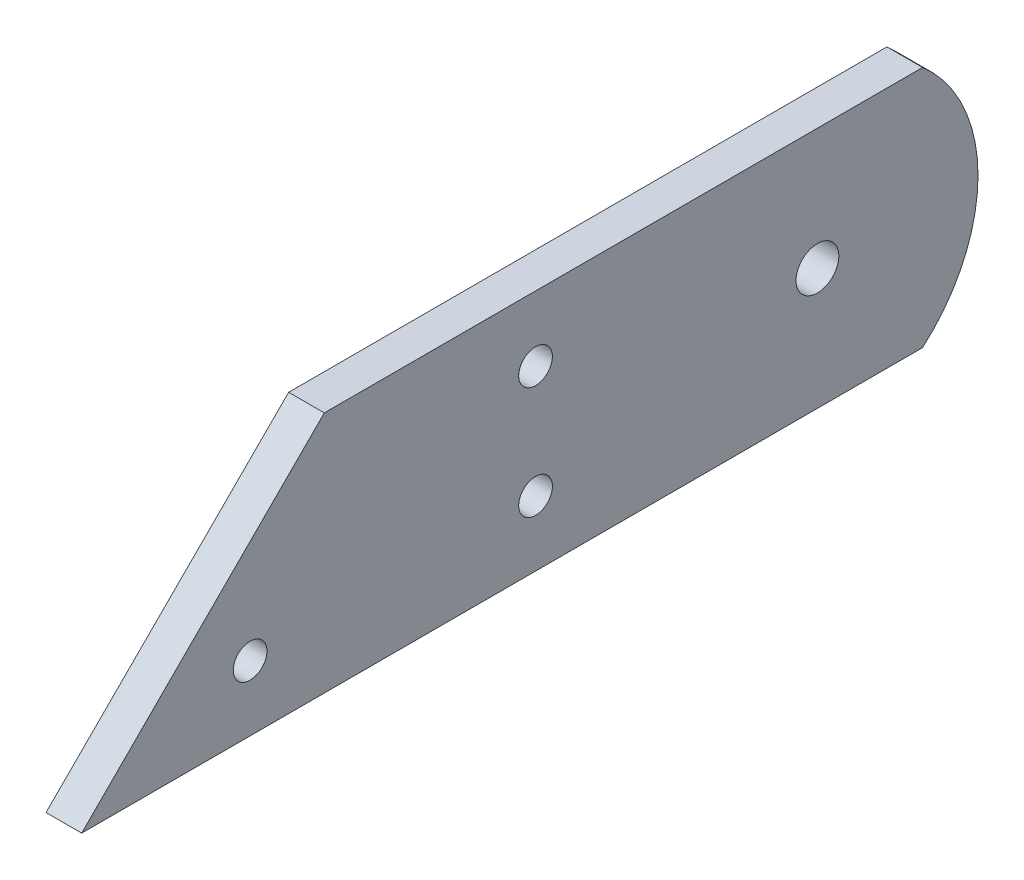
ISO-10303-21;
HEADER;
FILE_DESCRIPTION(('STEP AP214'),'2;1');
FILE_NAME('part.step','',(''),(''),'','','');
FILE_SCHEMA(('AUTOMOTIVE_DESIGN { 1 0 10303 214 1 1 1 1 }'));
ENDSEC;
DATA;
#1=APPLICATION_CONTEXT('core data for automotive mechanical design processes');
#2=APPLICATION_PROTOCOL_DEFINITION('international standard','automotive_design',2000,#1);
#3=PRODUCT_CONTEXT('',#1,'mechanical');
#4=PRODUCT('Part','Part','',(#3));
#5=PRODUCT_RELATED_PRODUCT_CATEGORY('part','',(#4));
#6=PRODUCT_DEFINITION_FORMATION('','',#4);
#7=PRODUCT_DEFINITION_CONTEXT('part definition',#1,'design');
#8=PRODUCT_DEFINITION('design','',#6,#7);
#9=PRODUCT_DEFINITION_SHAPE('','',#8);
#10=(LENGTH_UNIT() NAMED_UNIT(*) SI_UNIT(.MILLI.,.METRE.));
#11=(NAMED_UNIT(*) PLANE_ANGLE_UNIT() SI_UNIT($,.RADIAN.));
#12=(NAMED_UNIT(*) SI_UNIT($,.STERADIAN.) SOLID_ANGLE_UNIT());
#13=UNCERTAINTY_MEASURE_WITH_UNIT(LENGTH_MEASURE(1.E-05),#10,'distance_accuracy_value','');
#14=(GEOMETRIC_REPRESENTATION_CONTEXT(3) GLOBAL_UNCERTAINTY_ASSIGNED_CONTEXT((#13)) GLOBAL_UNIT_ASSIGNED_CONTEXT((#10,
#11,#12)) REPRESENTATION_CONTEXT('',''));
#15=CARTESIAN_POINT('',(0.,0.,0.));
#16=DIRECTION('',(0.,0.,1.));
#17=DIRECTION('',(1.,0.,0.));
#18=AXIS2_PLACEMENT_3D('',#15,#16,#17);
#19=CARTESIAN_POINT('',(6.35,43.18,0.));
#20=DIRECTION('',(0.,-1.,0.));
#21=DIRECTION('',(0.,0.,-1.));
#22=AXIS2_PLACEMENT_3D('',#19,#20,#21);
#23=PLANE('',#22);
#24=DIRECTION('',(0.,0.,1.));
#25=VECTOR('',#24,1.);
#26=CARTESIAN_POINT('',(0.,43.18,0.));
#27=LINE('',#26,#25);
#28=CARTESIAN_POINT('',(0.,43.18,-43.4811108330197));
#29=VERTEX_POINT('',#28);
#30=CARTESIAN_POINT('',(0.,43.18,62.9919999999995));
#31=VERTEX_POINT('',#30);
#32=EDGE_CURVE('E94',#29,#31,#27,.T.);
#33=ORIENTED_EDGE('',*,*,#32,.T.);
#34=DIRECTION('',(-1.,0.,0.));
#35=VECTOR('',#34,1.);
#36=CARTESIAN_POINT('',(6.35,43.18,62.9919999999995));
#37=LINE('',#36,#35);
#38=CARTESIAN_POINT('',(6.35,43.18,62.9919999999995));
#39=VERTEX_POINT('',#38);
#40=EDGE_CURVE('E11',#39,#31,#37,.T.);
#41=ORIENTED_EDGE('',*,*,#40,.F.);
#42=DIRECTION('',(0.,0.,1.));
#43=VECTOR('',#42,1.);
#44=CARTESIAN_POINT('',(6.35,43.18,0.));
#45=LINE('',#44,#43);
#46=CARTESIAN_POINT('',(6.34999999999999,43.18,-43.4811108330197));
#47=VERTEX_POINT('',#46);
#48=EDGE_CURVE('E49',#47,#39,#45,.T.);
#49=ORIENTED_EDGE('',*,*,#48,.F.);
#50=DIRECTION('',(-1.,0.,0.));
#51=VECTOR('',#50,1.);
#52=CARTESIAN_POINT('',(80.1238835157808,43.18,-43.4811108330197));
#53=LINE('',#52,#51);
#54=EDGE_CURVE('E90',#47,#29,#53,.T.);
#55=ORIENTED_EDGE('',*,*,#54,.T.);
#56=EDGE_LOOP('',(#33,#41,#49,#55));
#57=FACE_BOUND('',#56,.T.);
#58=ADVANCED_FACE('F35',(#57),#23,.F.);
#59=CARTESIAN_POINT('',(6.35,0.,106.172));
#60=DIRECTION('',(0.,-0.707106781186551,-0.707106781186544));
#61=DIRECTION('',(0.,0.707106781186544,-0.707106781186551));
#62=AXIS2_PLACEMENT_3D('',#59,#60,#61);
#63=PLANE('',#62);
#64=DIRECTION('',(0.,-0.707106781186544,0.707106781186551));
#65=VECTOR('',#64,1.);
#66=CARTESIAN_POINT('',(0.,0.,106.172));
#67=LINE('',#66,#65);
#68=CARTESIAN_POINT('',(0.,0.,106.172));
#69=VERTEX_POINT('',#68);
#70=EDGE_CURVE('E83',#31,#69,#67,.T.);
#71=ORIENTED_EDGE('',*,*,#70,.T.);
#72=DIRECTION('',(1.,0.,0.));
#73=VECTOR('',#72,1.);
#74=CARTESIAN_POINT('',(0.,0.,106.172));
#75=LINE('',#74,#73);
#76=CARTESIAN_POINT('',(6.34999999999999,2.48065457064683E-13,106.172));
#77=VERTEX_POINT('',#76);
#78=EDGE_CURVE('E79',#69,#77,#75,.T.);
#79=ORIENTED_EDGE('',*,*,#78,.T.);
#80=DIRECTION('',(0.,-0.707106781186544,0.707106781186551));
#81=VECTOR('',#80,1.);
#82=CARTESIAN_POINT('',(6.35,0.,106.172));
#83=LINE('',#82,#81);
#84=EDGE_CURVE('E126',#39,#77,#83,.T.);
#85=ORIENTED_EDGE('',*,*,#84,.F.);
#86=ORIENTED_EDGE('',*,*,#40,.T.);
#87=EDGE_LOOP('',(#71,#79,#85,#86));
#88=FACE_BOUND('',#87,.T.);
#89=ADVANCED_FACE('F131',(#88),#63,.F.);
#90=CARTESIAN_POINT('',(6.35,0.,0.));
#91=DIRECTION('',(0.,1.,0.));
#92=DIRECTION('',(0.,0.,1.));
#93=AXIS2_PLACEMENT_3D('',#90,#91,#92);
#94=PLANE('',#93);
#95=DIRECTION('',(0.,0.,-1.));
#96=VECTOR('',#95,1.);
#97=CARTESIAN_POINT('',(6.35,0.,0.));
#98=LINE('',#97,#96);
#99=CARTESIAN_POINT('',(6.34999999999999,0.,-43.4811108330197));
#100=VERTEX_POINT('',#99);
#101=EDGE_CURVE('E43',#77,#100,#98,.T.);
#102=ORIENTED_EDGE('',*,*,#101,.F.);
#103=ORIENTED_EDGE('',*,*,#78,.F.);
#104=DIRECTION('',(0.,0.,-1.));
#105=VECTOR('',#104,1.);
#106=CARTESIAN_POINT('',(0.,0.,0.));
#107=LINE('',#106,#105);
#108=CARTESIAN_POINT('',(0.,0.,-43.4811108330197));
#109=VERTEX_POINT('',#108);
#110=EDGE_CURVE('E72',#69,#109,#107,.T.);
#111=ORIENTED_EDGE('',*,*,#110,.T.);
#112=DIRECTION('',(-1.,0.,0.));
#113=VECTOR('',#112,1.);
#114=CARTESIAN_POINT('',(80.1238835157808,0.,-43.4811108330197));
#115=LINE('',#114,#113);
#116=EDGE_CURVE('E76',#100,#109,#115,.T.);
#117=ORIENTED_EDGE('',*,*,#116,.F.);
#118=EDGE_LOOP('',(#102,#103,#111,#117));
#119=FACE_BOUND('',#118,.T.);
#120=ADVANCED_FACE('F75',(#119),#94,.F.);
#121=CARTESIAN_POINT('',(6.35,21.59,-24.7620690573304));
#122=DIRECTION('',(1.,0.,0.));
#123=DIRECTION('',(0.,0.,-1.));
#124=AXIS2_PLACEMENT_3D('',#121,#122,#123);
#125=PLANE('',#124);
#126=ORIENTED_EDGE('',*,*,#84,.T.);
#127=ORIENTED_EDGE('',*,*,#101,.T.);
#128=CARTESIAN_POINT('',(6.34999999999999,21.59,-24.7620690573304));
#129=DIRECTION('',(1.,0.,0.));
#130=DIRECTION('',(0.,0.,-1.));
#131=AXIS2_PLACEMENT_3D('',#128,#129,#130);
#132=CIRCLE('',#131,28.575);
#133=EDGE_CURVE('E89',#47,#100,#132,.F.);
#134=ORIENTED_EDGE('',*,*,#133,.F.);
#135=ORIENTED_EDGE('',*,*,#48,.T.);
#136=EDGE_LOOP('',(#126,#127,#134,#135));
#137=FACE_BOUND('',#136,.T.);
#138=CARTESIAN_POINT('',(6.35,31.59,25.4));
#139=DIRECTION('',(1.,0.,0.));
#140=DIRECTION('',(0.,0.,-1.));
#141=AXIS2_PLACEMENT_3D('',#138,#139,#140);
#142=CIRCLE('',#141,3.);
#143=CARTESIAN_POINT('',(6.35,31.59,22.4));
#144=VERTEX_POINT('',#143);
#145=EDGE_CURVE('E110',#144,#144,#142,.T.);
#146=ORIENTED_EDGE('',*,*,#145,.F.);
#147=EDGE_LOOP('',(#146));
#148=FACE_BOUND('',#147,.T.);
#149=CARTESIAN_POINT('',(6.35,11.59,25.4));
#150=DIRECTION('',(1.,0.,0.));
#151=DIRECTION('',(0.,0.,-1.));
#152=AXIS2_PLACEMENT_3D('',#149,#150,#151);
#153=CIRCLE('',#152,3.);
#154=CARTESIAN_POINT('',(6.35,11.59,22.4));
#155=VERTEX_POINT('',#154);
#156=EDGE_CURVE('E116',#155,#155,#153,.T.);
#157=ORIENTED_EDGE('',*,*,#156,.F.);
#158=EDGE_LOOP('',(#157));
#159=FACE_BOUND('',#158,.T.);
#160=CARTESIAN_POINT('',(6.35,11.59,76.2));
#161=DIRECTION('',(1.,0.,0.));
#162=DIRECTION('',(0.,0.,-1.));
#163=AXIS2_PLACEMENT_3D('',#160,#161,#162);
#164=CIRCLE('',#163,3.00000000000001);
#165=CARTESIAN_POINT('',(6.35,11.59,73.2));
#166=VERTEX_POINT('',#165);
#167=EDGE_CURVE('E100',#166,#166,#164,.T.);
#168=ORIENTED_EDGE('',*,*,#167,.F.);
#169=EDGE_LOOP('',(#168));
#170=FACE_BOUND('',#169,.T.);
#171=CARTESIAN_POINT('',(6.34999999999999,21.59,-24.7620690573304));
#172=DIRECTION('',(1.,0.,0.));
#173=DIRECTION('',(0.,0.,-1.));
#174=AXIS2_PLACEMENT_3D('',#171,#172,#173);
#175=CIRCLE('',#174,3.81);
#176=CARTESIAN_POINT('',(6.34999999999998,21.59,-20.9520690573304));
#177=VERTEX_POINT('',#176);
#178=EDGE_CURVE('E96',#177,#177,#175,.F.);
#179=ORIENTED_EDGE('',*,*,#178,.T.);
#180=EDGE_LOOP('',(#179));
#181=FACE_BOUND('',#180,.T.);
#182=ADVANCED_FACE('F134',(#137,#148,#159,#170,#181),#125,.T.);
#183=CARTESIAN_POINT('',(0.,21.59,-24.7620690573304));
#184=DIRECTION('',(1.,0.,0.));
#185=DIRECTION('',(0.,0.,-1.));
#186=AXIS2_PLACEMENT_3D('',#183,#184,#185);
#187=PLANE('',#186);
#188=CARTESIAN_POINT('',(0.,31.59,25.4));
#189=DIRECTION('',(1.,0.,0.));
#190=DIRECTION('',(0.,0.,-1.));
#191=AXIS2_PLACEMENT_3D('',#188,#189,#190);
#192=CIRCLE('',#191,3.);
#193=CARTESIAN_POINT('',(0.,31.59,22.4));
#194=VERTEX_POINT('',#193);
#195=EDGE_CURVE('E107',#194,#194,#192,.T.);
#196=ORIENTED_EDGE('',*,*,#195,.T.);
#197=EDGE_LOOP('',(#196));
#198=FACE_BOUND('',#197,.T.);
#199=CARTESIAN_POINT('',(0.,11.59,25.4));
#200=DIRECTION('',(1.,0.,0.));
#201=DIRECTION('',(0.,0.,-1.));
#202=AXIS2_PLACEMENT_3D('',#199,#200,#201);
#203=CIRCLE('',#202,3.);
#204=CARTESIAN_POINT('',(0.,11.59,22.4));
#205=VERTEX_POINT('',#204);
#206=EDGE_CURVE('E113',#205,#205,#203,.T.);
#207=ORIENTED_EDGE('',*,*,#206,.T.);
#208=EDGE_LOOP('',(#207));
#209=FACE_BOUND('',#208,.T.);
#210=CARTESIAN_POINT('',(0.,11.59,76.2));
#211=DIRECTION('',(1.,0.,0.));
#212=DIRECTION('',(0.,0.,-1.));
#213=AXIS2_PLACEMENT_3D('',#210,#211,#212);
#214=CIRCLE('',#213,3.00000000000001);
#215=CARTESIAN_POINT('',(0.,11.59,73.2));
#216=VERTEX_POINT('',#215);
#217=EDGE_CURVE('E119',#216,#216,#214,.T.);
#218=ORIENTED_EDGE('',*,*,#217,.T.);
#219=EDGE_LOOP('',(#218));
#220=FACE_BOUND('',#219,.T.);
#221=ORIENTED_EDGE('',*,*,#110,.F.);
#222=ORIENTED_EDGE('',*,*,#70,.F.);
#223=ORIENTED_EDGE('',*,*,#32,.F.);
#224=CARTESIAN_POINT('',(0.,21.59,-24.7620690573304));
#225=DIRECTION('',(-1.,0.,0.));
#226=DIRECTION('',(0.,0.,1.));
#227=AXIS2_PLACEMENT_3D('',#224,#225,#226);
#228=CIRCLE('',#227,28.575);
#229=EDGE_CURVE('E88',#29,#109,#228,.T.);
#230=ORIENTED_EDGE('',*,*,#229,.T.);
#231=EDGE_LOOP('',(#221,#222,#223,#230));
#232=FACE_BOUND('',#231,.T.);
#233=CARTESIAN_POINT('',(0.,21.59,-24.7620690573304));
#234=DIRECTION('',(-1.,0.,0.));
#235=DIRECTION('',(0.,0.,1.));
#236=AXIS2_PLACEMENT_3D('',#233,#234,#235);
#237=CIRCLE('',#236,3.81);
#238=CARTESIAN_POINT('',(0.,21.59,-20.9520690573304));
#239=VERTEX_POINT('',#238);
#240=EDGE_CURVE('E97',#239,#239,#237,.T.);
#241=ORIENTED_EDGE('',*,*,#240,.F.);
#242=EDGE_LOOP('',(#241));
#243=FACE_BOUND('',#242,.T.);
#244=ADVANCED_FACE('F92',(#198,#209,#220,#232,#243),#187,.F.);
#245=CARTESIAN_POINT('',(0.,11.59,76.2));
#246=DIRECTION('',(1.,0.,0.));
#247=DIRECTION('',(0.,0.,-1.));
#248=AXIS2_PLACEMENT_3D('',#245,#246,#247);
#249=CYLINDRICAL_SURFACE('',#248,3.00000000000001);
#250=ORIENTED_EDGE('',*,*,#217,.F.);
#251=EDGE_LOOP('',(#250));
#252=FACE_BOUND('',#251,.T.);
#253=ORIENTED_EDGE('',*,*,#167,.T.);
#254=EDGE_LOOP('',(#253));
#255=FACE_BOUND('',#254,.T.);
#256=ADVANCED_FACE('F166',(#252,#255),#249,.F.);
#257=CARTESIAN_POINT('',(0.,11.59,25.4));
#258=DIRECTION('',(1.,0.,0.));
#259=DIRECTION('',(0.,0.,-1.));
#260=AXIS2_PLACEMENT_3D('',#257,#258,#259);
#261=CYLINDRICAL_SURFACE('',#260,3.);
#262=ORIENTED_EDGE('',*,*,#206,.F.);
#263=EDGE_LOOP('',(#262));
#264=FACE_BOUND('',#263,.T.);
#265=ORIENTED_EDGE('',*,*,#156,.T.);
#266=EDGE_LOOP('',(#265));
#267=FACE_BOUND('',#266,.T.);
#268=ADVANCED_FACE('F171',(#264,#267),#261,.F.);
#269=CARTESIAN_POINT('',(0.,31.59,25.4));
#270=DIRECTION('',(1.,0.,0.));
#271=DIRECTION('',(0.,0.,-1.));
#272=AXIS2_PLACEMENT_3D('',#269,#270,#271);
#273=CYLINDRICAL_SURFACE('',#272,3.);
#274=ORIENTED_EDGE('',*,*,#195,.F.);
#275=EDGE_LOOP('',(#274));
#276=FACE_BOUND('',#275,.T.);
#277=ORIENTED_EDGE('',*,*,#145,.T.);
#278=EDGE_LOOP('',(#277));
#279=FACE_BOUND('',#278,.T.);
#280=ADVANCED_FACE('F153',(#276,#279),#273,.F.);
#281=CARTESIAN_POINT('',(80.1238835157808,21.59,-24.7620690573304));
#282=DIRECTION('',(-1.,0.,0.));
#283=DIRECTION('',(0.,0.,1.));
#284=AXIS2_PLACEMENT_3D('',#281,#282,#283);
#285=CYLINDRICAL_SURFACE('',#284,28.575);
#286=ORIENTED_EDGE('',*,*,#54,.F.);
#287=ORIENTED_EDGE('',*,*,#133,.T.);
#288=ORIENTED_EDGE('',*,*,#116,.T.);
#289=ORIENTED_EDGE('',*,*,#229,.F.);
#290=EDGE_LOOP('',(#286,#287,#288,#289));
#291=FACE_BOUND('',#290,.T.);
#292=ADVANCED_FACE('F87',(#291),#285,.T.);
#293=CARTESIAN_POINT('',(80.1238835157808,21.59,-24.7620690573304));
#294=DIRECTION('',(-1.,0.,0.));
#295=DIRECTION('',(0.,0.,1.));
#296=AXIS2_PLACEMENT_3D('',#293,#294,#295);
#297=CYLINDRICAL_SURFACE('',#296,3.81);
#298=CARTESIAN_POINT('',(0.,21.59,-20.9520690573304));
#299=CARTESIAN_POINT('',(0.0661458333333457,21.59,-20.9520690573304));
#300=CARTESIAN_POINT('',(0.132291666666678,21.59,-20.9520690573304));
#301=CARTESIAN_POINT('',(0.264583333333341,21.59,-20.9520690573304));
#302=CARTESIAN_POINT('',(0.330729166666673,21.59,-20.9520690573304));
#303=CARTESIAN_POINT('',(0.463020833333341,21.59,-20.9520690573304));
#304=CARTESIAN_POINT('',(0.529166666666678,21.59,-20.9520690573304));
#305=CARTESIAN_POINT('',(0.661458333333346,21.59,-20.9520690573304));
#306=CARTESIAN_POINT('',(0.727604166666678,21.59,-20.9520690573304));
#307=CARTESIAN_POINT('',(0.859895833333342,21.59,-20.9520690573304));
#308=CARTESIAN_POINT('',(0.926041666666673,21.59,-20.9520690573304));
#309=CARTESIAN_POINT('',(1.05833333333334,21.59,-20.9520690573304));
#310=CARTESIAN_POINT('',(1.12447916666668,21.59,-20.9520690573304));
#311=CARTESIAN_POINT('',(1.25677083333335,21.59,-20.9520690573304));
#312=CARTESIAN_POINT('',(1.32291666666668,21.59,-20.9520690573304));
#313=CARTESIAN_POINT('',(1.45520833333334,21.59,-20.9520690573304));
#314=CARTESIAN_POINT('',(1.52135416666667,21.59,-20.9520690573304));
#315=CARTESIAN_POINT('',(1.65364583333334,21.59,-20.9520690573304));
#316=CARTESIAN_POINT('',(1.71979166666667,21.59,-20.9520690573304));
#317=CARTESIAN_POINT('',(1.85208333333333,21.59,-20.9520690573304));
#318=CARTESIAN_POINT('',(1.91822916666666,21.59,-20.9520690573304));
#319=CARTESIAN_POINT('',(2.05052083333333,21.59,-20.9520690573304));
#320=CARTESIAN_POINT('',(2.11666666666667,21.59,-20.9520690573304));
#321=CARTESIAN_POINT('',(2.24895833333334,21.59,-20.9520690573304));
#322=CARTESIAN_POINT('',(2.31510416666667,21.59,-20.9520690573304));
#323=CARTESIAN_POINT('',(2.44739583333333,21.59,-20.9520690573304));
#324=CARTESIAN_POINT('',(2.51354166666667,21.59,-20.9520690573304));
#325=CARTESIAN_POINT('',(2.64583333333333,21.59,-20.9520690573304));
#326=CARTESIAN_POINT('',(2.71197916666667,21.59,-20.9520690573304));
#327=CARTESIAN_POINT('',(2.84427083333334,21.59,-20.9520690573304));
#328=CARTESIAN_POINT('',(2.91041666666667,21.59,-20.9520690573304));
#329=CARTESIAN_POINT('',(3.04270833333333,21.59,-20.9520690573304));
#330=CARTESIAN_POINT('',(3.10885416666667,21.59,-20.9520690573304));
#331=CARTESIAN_POINT('',(3.24114583333333,21.59,-20.9520690573304));
#332=CARTESIAN_POINT('',(3.30729166666666,21.59,-20.9520690573304));
#333=CARTESIAN_POINT('',(3.43958333333332,21.59,-20.9520690573304));
#334=CARTESIAN_POINT('',(3.50572916666666,21.59,-20.9520690573304));
#335=CARTESIAN_POINT('',(3.63802083333332,21.59,-20.9520690573304));
#336=CARTESIAN_POINT('',(3.70416666666666,21.59,-20.9520690573304));
#337=CARTESIAN_POINT('',(3.83645833333333,21.59,-20.9520690573304));
#338=CARTESIAN_POINT('',(3.90260416666666,21.59,-20.9520690573304));
#339=CARTESIAN_POINT('',(4.03489583333333,21.59,-20.9520690573304));
#340=CARTESIAN_POINT('',(4.10104166666666,21.59,-20.9520690573304));
#341=CARTESIAN_POINT('',(4.23333333333333,21.59,-20.9520690573304));
#342=CARTESIAN_POINT('',(4.29947916666666,21.59,-20.9520690573304));
#343=CARTESIAN_POINT('',(4.43177083333333,21.59,-20.9520690573304));
#344=CARTESIAN_POINT('',(4.49791666666666,21.59,-20.9520690573304));
#345=CARTESIAN_POINT('',(4.63020833333333,21.59,-20.9520690573304));
#346=CARTESIAN_POINT('',(4.69635416666666,21.59,-20.9520690573304));
#347=CARTESIAN_POINT('',(4.82864583333332,21.59,-20.9520690573304));
#348=CARTESIAN_POINT('',(4.89479166666665,21.59,-20.9520690573304));
#349=CARTESIAN_POINT('',(5.02708333333332,21.59,-20.9520690573304));
#350=CARTESIAN_POINT('',(5.09322916666665,21.59,-20.9520690573304));
#351=CARTESIAN_POINT('',(5.22552083333332,21.59,-20.9520690573304));
#352=CARTESIAN_POINT('',(5.29166666666665,21.59,-20.9520690573304));
#353=CARTESIAN_POINT('',(5.42395833333332,21.59,-20.9520690573304));
#354=CARTESIAN_POINT('',(5.49010416666665,21.59,-20.9520690573304));
#355=CARTESIAN_POINT('',(5.62239583333332,21.59,-20.9520690573304));
#356=CARTESIAN_POINT('',(5.68854166666665,21.59,-20.9520690573304));
#357=CARTESIAN_POINT('',(5.82083333333332,21.59,-20.9520690573304));
#358=CARTESIAN_POINT('',(5.88697916666665,21.59,-20.9520690573304));
#359=CARTESIAN_POINT('',(6.01927083333332,21.59,-20.9520690573304));
#360=CARTESIAN_POINT('',(6.08541666666665,21.59,-20.9520690573304));
#361=CARTESIAN_POINT('',(6.21770833333332,21.59,-20.9520690573304));
#362=CARTESIAN_POINT('',(6.28385416666665,21.59,-20.9520690573304));
#363=CARTESIAN_POINT('',(6.34999999999998,21.59,-20.9520690573304));
#364=B_SPLINE_CURVE_WITH_KNOTS('',3,(#298,#299,#300,#301,#302,#303,#304,#305,#306,#307,#308,
#309,#310,#311,#312,#313,#314,#315,#316,#317,#318,#319,#320,#321,#322,#323,#324,#325,#326,#327,
#328,#329,#330,#331,#332,#333,#334,#335,#336,#337,#338,#339,#340,#341,#342,#343,#344,#345,#346,
#347,#348,#349,#350,#351,#352,#353,#354,#355,#356,#357,#358,#359,#360,#361,#362,#363),
.UNSPECIFIED.,.F.,.F.,(4,2,2,2,2,2,2,2,2,2,2,2,2,2,2,2,2,2,2,2,2,2,2,2,2,2,2,2,2,2,2,2,4),(0.,
0.198437499999995,0.396874999999991,0.5953125,0.793749999999996,0.992187499999991,1.190625,
1.3890625,1.58749999999999,1.78593749999999,1.98437499999998,2.18281249999999,2.38124999999999,
2.57968749999998,2.77812499999999,2.97656249999999,3.17499999999998,3.37343749999998,
3.57187499999997,3.77031249999998,3.96874999999998,4.16718749999997,4.36562499999998,
4.56406249999998,4.76249999999998,4.96093749999997,5.15937499999997,5.35781249999998,
5.55624999999997,5.75468749999997,5.95312499999998,6.15156249999997,6.34999999999997),.UNSPECIFIED.);
#365=EDGE_CURVE('BSEAM146',#239,#177,#364,.T.);
#366=ORIENTED_EDGE('',*,*,#240,.T.);
#367=ORIENTED_EDGE('',*,*,#178,.F.);
#368=ORIENTED_EDGE('',*,*,#365,.T.);
#369=ORIENTED_EDGE('',*,*,#365,.F.);
#370=EDGE_LOOP('',(#366,#368,#367,#369));
#371=FACE_BOUND('',#370,.T.);
#372=ADVANCED_FACE('F146',(#371),#297,.F.);
#373=CLOSED_SHELL('',(#58,#89,#120,#182,#244,#256,#268,#280,#292,#372));
#374=MANIFOLD_SOLID_BREP('B2',#373);
#375=ADVANCED_BREP_SHAPE_REPRESENTATION('',(#18,#374),#14);
#376=SHAPE_DEFINITION_REPRESENTATION(#9,#375);
ENDSEC;
END-ISO-10303-21;
